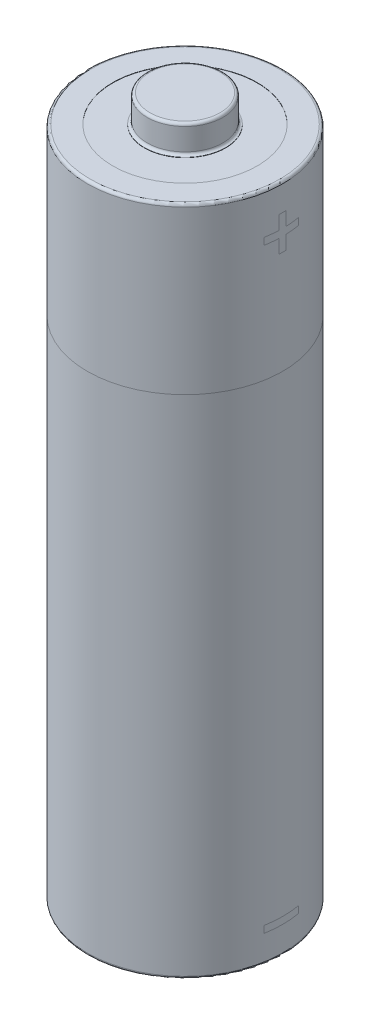
ISO-10303-21;
HEADER;
FILE_DESCRIPTION(('STEP AP214'),'2;1');
FILE_NAME('part.step','',(''),(''),'','','');
FILE_SCHEMA(('AUTOMOTIVE_DESIGN { 1 0 10303 214 1 1 1 1 }'));
ENDSEC;
DATA;
#1=APPLICATION_CONTEXT('core data for automotive mechanical design processes');
#2=APPLICATION_PROTOCOL_DEFINITION('international standard','automotive_design',2000,#1);
#3=PRODUCT_CONTEXT('',#1,'mechanical');
#4=PRODUCT('Part','Part','',(#3));
#5=PRODUCT_RELATED_PRODUCT_CATEGORY('part','',(#4));
#6=PRODUCT_DEFINITION_FORMATION('','',#4);
#7=PRODUCT_DEFINITION_CONTEXT('part definition',#1,'design');
#8=PRODUCT_DEFINITION('design','',#6,#7);
#9=PRODUCT_DEFINITION_SHAPE('','',#8);
#10=(LENGTH_UNIT() NAMED_UNIT(*) SI_UNIT(.MILLI.,.METRE.));
#11=(NAMED_UNIT(*) PLANE_ANGLE_UNIT() SI_UNIT($,.RADIAN.));
#12=(NAMED_UNIT(*) SI_UNIT($,.STERADIAN.) SOLID_ANGLE_UNIT());
#13=UNCERTAINTY_MEASURE_WITH_UNIT(LENGTH_MEASURE(1.E-05),#10,'distance_accuracy_value','');
#14=(GEOMETRIC_REPRESENTATION_CONTEXT(3) GLOBAL_UNCERTAINTY_ASSIGNED_CONTEXT((#13)) GLOBAL_UNIT_ASSIGNED_CONTEXT((#10,
#11,#12)) REPRESENTATION_CONTEXT('',''));
#15=CARTESIAN_POINT('',(0.,0.,0.));
#16=DIRECTION('',(0.,0.,1.));
#17=DIRECTION('',(1.,0.,0.));
#18=AXIS2_PLACEMENT_3D('',#15,#16,#17);
#19=CARTESIAN_POINT('',(0.,48.8,0.));
#20=DIRECTION('',(0.,-1.,0.));
#21=DIRECTION('',(0.,0.,-1.));
#22=AXIS2_PLACEMENT_3D('',#19,#20,#21);
#23=CYLINDRICAL_SURFACE('',#22,7.1);
#24=DIRECTION('',(0.,-1.,0.));
#25=VECTOR('',#24,1.);
#26=CARTESIAN_POINT('',(6.98909865433305,48.8,1.24999999999998));
#27=LINE('',#26,#25);
#28=CARTESIAN_POINT('',(6.98909865433305,2.5,1.25));
#29=VERTEX_POINT('',#28);
#30=CARTESIAN_POINT('',(6.98909865433305,2.,1.25));
#31=VERTEX_POINT('',#30);
#32=EDGE_CURVE('E25',#29,#31,#27,.T.);
#33=ORIENTED_EDGE('',*,*,#32,.F.);
#34=CARTESIAN_POINT('',(0.,2.5,0.));
#35=DIRECTION('',(0.,-1.,0.));
#36=DIRECTION('',(0.,0.,-1.));
#37=AXIS2_PLACEMENT_3D('',#34,#35,#36);
#38=CIRCLE('',#37,7.1);
#39=CARTESIAN_POINT('',(6.98909865433305,2.5,-1.25));
#40=VERTEX_POINT('',#39);
#41=EDGE_CURVE('E246',#40,#29,#38,.T.);
#42=ORIENTED_EDGE('',*,*,#41,.F.);
#43=DIRECTION('',(0.,-1.,0.));
#44=VECTOR('',#43,1.);
#45=CARTESIAN_POINT('',(6.98909865433305,48.8,-1.24999999999998));
#46=LINE('',#45,#44);
#47=CARTESIAN_POINT('',(6.98909865433305,2.,-1.24999999999998));
#48=VERTEX_POINT('',#47);
#49=EDGE_CURVE('E257',#48,#40,#46,.F.);
#50=ORIENTED_EDGE('',*,*,#49,.F.);
#51=CARTESIAN_POINT('',(0.,2.,0.));
#52=DIRECTION('',(0.,1.,0.));
#53=DIRECTION('',(0.,0.,1.));
#54=AXIS2_PLACEMENT_3D('',#51,#52,#53);
#55=CIRCLE('',#54,7.1);
#56=EDGE_CURVE('E41',#31,#48,#55,.T.);
#57=ORIENTED_EDGE('',*,*,#56,.F.);
#58=EDGE_LOOP('',(#33,#42,#50,#57));
#59=FACE_BOUND('',#58,.T.);
#60=CARTESIAN_POINT('',(0.,0.2,0.));
#61=DIRECTION('',(0.,1.,0.));
#62=DIRECTION('',(0.,0.,1.));
#63=AXIS2_PLACEMENT_3D('',#60,#61,#62);
#64=CIRCLE('',#63,7.1);
#65=CARTESIAN_POINT('',(0.,0.2,7.1));
#66=VERTEX_POINT('',#65);
#67=EDGE_CURVE('E265',#66,#66,#64,.T.);
#68=ORIENTED_EDGE('',*,*,#67,.T.);
#69=EDGE_LOOP('',(#68));
#70=FACE_BOUND('',#69,.T.);
#71=DIRECTION('',(0.,-1.,0.));
#72=VECTOR('',#71,1.);
#73=CARTESIAN_POINT('',(-6.98909865433305,48.8,1.24999999999998));
#74=LINE('',#73,#72);
#75=CARTESIAN_POINT('',(-6.98909865433305,2.,1.25));
#76=VERTEX_POINT('',#75);
#77=CARTESIAN_POINT('',(-6.98909865433305,2.5,1.25));
#78=VERTEX_POINT('',#77);
#79=EDGE_CURVE('E254',#76,#78,#74,.F.);
#80=ORIENTED_EDGE('',*,*,#79,.F.);
#81=CARTESIAN_POINT('',(-6.98909865433305,2.,-1.24999999999998));
#82=VERTEX_POINT('',#81);
#83=EDGE_CURVE('E250',#82,#76,#55,.T.);
#84=ORIENTED_EDGE('',*,*,#83,.F.);
#85=DIRECTION('',(0.,-1.,0.));
#86=VECTOR('',#85,1.);
#87=CARTESIAN_POINT('',(-6.98909865433305,48.8,-1.24999999999998));
#88=LINE('',#87,#86);
#89=CARTESIAN_POINT('',(-6.98909865433305,2.5,-1.25));
#90=VERTEX_POINT('',#89);
#91=EDGE_CURVE('E245',#90,#82,#88,.T.);
#92=ORIENTED_EDGE('',*,*,#91,.F.);
#93=EDGE_CURVE('E241',#78,#90,#38,.T.);
#94=ORIENTED_EDGE('',*,*,#93,.F.);
#95=EDGE_LOOP('',(#80,#84,#92,#94));
#96=FACE_BOUND('',#95,.T.);
#97=CARTESIAN_POINT('',(0.,36.8,0.));
#98=DIRECTION('',(0.,1.,0.));
#99=DIRECTION('',(0.,0.,1.));
#100=AXIS2_PLACEMENT_3D('',#97,#98,#99);
#101=CIRCLE('',#100,7.1);
#102=CARTESIAN_POINT('',(0.,36.8,7.1));
#103=VERTEX_POINT('',#102);
#104=EDGE_CURVE('E11',#103,#103,#101,.T.);
#105=ORIENTED_EDGE('',*,*,#104,.F.);
#106=EDGE_LOOP('',(#105));
#107=FACE_BOUND('',#106,.T.);
#108=ADVANCED_FACE('F16',(#59,#70,#96,#107),#23,.T.);
#109=ORIENTED_EDGE('',*,*,#104,.T.);
#110=EDGE_LOOP('',(#109));
#111=FACE_BOUND('',#110,.T.);
#112=CARTESIAN_POINT('',(0.,46.8,0.));
#113=DIRECTION('',(0.,-1.,0.));
#114=DIRECTION('',(0.,0.,-1.));
#115=AXIS2_PLACEMENT_3D('',#112,#113,#114);
#116=CIRCLE('',#115,7.1);
#117=CARTESIAN_POINT('',(7.09559722644965,46.8,-0.25));
#118=VERTEX_POINT('',#117);
#119=CARTESIAN_POINT('',(7.09559722644965,46.8,0.25));
#120=VERTEX_POINT('',#119);
#121=EDGE_CURVE('E173',#118,#120,#116,.T.);
#122=ORIENTED_EDGE('',*,*,#121,.F.);
#123=DIRECTION('',(0.,-1.,0.));
#124=VECTOR('',#123,1.);
#125=CARTESIAN_POINT('',(7.09559722644965,48.8,-0.25));
#126=LINE('',#125,#124);
#127=CARTESIAN_POINT('',(7.09559722644965,45.8,-0.25));
#128=VERTEX_POINT('',#127);
#129=EDGE_CURVE('E163',#128,#118,#126,.F.);
#130=ORIENTED_EDGE('',*,*,#129,.F.);
#131=CARTESIAN_POINT('',(0.,45.8,0.));
#132=DIRECTION('',(0.,-1.,0.));
#133=DIRECTION('',(0.,0.,-1.));
#134=AXIS2_PLACEMENT_3D('',#131,#132,#133);
#135=CIRCLE('',#134,7.1);
#136=CARTESIAN_POINT('',(6.98909865433305,45.8,-1.25));
#137=VERTEX_POINT('',#136);
#138=EDGE_CURVE('E160',#137,#128,#135,.T.);
#139=ORIENTED_EDGE('',*,*,#138,.F.);
#140=DIRECTION('',(0.,-1.,0.));
#141=VECTOR('',#140,1.);
#142=CARTESIAN_POINT('',(6.98909865433305,48.8,-1.25));
#143=LINE('',#142,#141);
#144=CARTESIAN_POINT('',(6.98909865433305,45.3,-1.25));
#145=VERTEX_POINT('',#144);
#146=EDGE_CURVE('E165',#145,#137,#143,.F.);
#147=ORIENTED_EDGE('',*,*,#146,.F.);
#148=CARTESIAN_POINT('',(0.,45.3,0.));
#149=DIRECTION('',(0.,1.,0.));
#150=DIRECTION('',(0.,0.,1.));
#151=AXIS2_PLACEMENT_3D('',#148,#149,#150);
#152=CIRCLE('',#151,7.1);
#153=CARTESIAN_POINT('',(7.09559722644965,45.3,-0.25));
#154=VERTEX_POINT('',#153);
#155=EDGE_CURVE('E188',#154,#145,#152,.T.);
#156=ORIENTED_EDGE('',*,*,#155,.F.);
#157=DIRECTION('',(0.,-1.,0.));
#158=VECTOR('',#157,1.);
#159=CARTESIAN_POINT('',(7.09559722644965,48.8,-0.250000000000004));
#160=LINE('',#159,#158);
#161=CARTESIAN_POINT('',(7.09559722644965,44.3,-0.250000000000004));
#162=VERTEX_POINT('',#161);
#163=EDGE_CURVE('E191',#162,#154,#160,.F.);
#164=ORIENTED_EDGE('',*,*,#163,.F.);
#165=CARTESIAN_POINT('',(0.,44.3,0.));
#166=DIRECTION('',(0.,1.,0.));
#167=DIRECTION('',(0.,0.,1.));
#168=AXIS2_PLACEMENT_3D('',#165,#166,#167);
#169=CIRCLE('',#168,7.1);
#170=CARTESIAN_POINT('',(7.09559722644965,44.3,0.25));
#171=VERTEX_POINT('',#170);
#172=EDGE_CURVE('E195',#171,#162,#169,.T.);
#173=ORIENTED_EDGE('',*,*,#172,.F.);
#174=DIRECTION('',(0.,-1.,0.));
#175=VECTOR('',#174,1.);
#176=CARTESIAN_POINT('',(7.09559722644965,48.8,0.250000000000004));
#177=LINE('',#176,#175);
#178=CARTESIAN_POINT('',(7.09559722644965,45.3,0.250000000000004));
#179=VERTEX_POINT('',#178);
#180=EDGE_CURVE('E198',#179,#171,#177,.T.);
#181=ORIENTED_EDGE('',*,*,#180,.F.);
#182=CARTESIAN_POINT('',(0.,45.3,0.));
#183=DIRECTION('',(0.,1.,0.));
#184=DIRECTION('',(0.,0.,1.));
#185=AXIS2_PLACEMENT_3D('',#182,#183,#184);
#186=CIRCLE('',#185,7.1);
#187=CARTESIAN_POINT('',(6.98909865433305,45.3,1.25));
#188=VERTEX_POINT('',#187);
#189=EDGE_CURVE('E201',#188,#179,#186,.T.);
#190=ORIENTED_EDGE('',*,*,#189,.F.);
#191=DIRECTION('',(0.,-1.,0.));
#192=VECTOR('',#191,1.);
#193=CARTESIAN_POINT('',(6.98909865433305,48.8,1.25));
#194=LINE('',#193,#192);
#195=CARTESIAN_POINT('',(6.98909865433305,45.8,1.25));
#196=VERTEX_POINT('',#195);
#197=EDGE_CURVE('E204',#196,#188,#194,.T.);
#198=ORIENTED_EDGE('',*,*,#197,.F.);
#199=CARTESIAN_POINT('',(0.,45.8,0.));
#200=DIRECTION('',(0.,-1.,0.));
#201=DIRECTION('',(0.,0.,-1.));
#202=AXIS2_PLACEMENT_3D('',#199,#200,#201);
#203=CIRCLE('',#202,7.1);
#204=CARTESIAN_POINT('',(7.09559722644965,45.8,0.25));
#205=VERTEX_POINT('',#204);
#206=EDGE_CURVE('E208',#205,#196,#203,.T.);
#207=ORIENTED_EDGE('',*,*,#206,.F.);
#208=DIRECTION('',(0.,-1.,0.));
#209=VECTOR('',#208,1.);
#210=CARTESIAN_POINT('',(7.09559722644965,48.8,0.25));
#211=LINE('',#210,#209);
#212=EDGE_CURVE('E211',#120,#205,#211,.T.);
#213=ORIENTED_EDGE('',*,*,#212,.F.);
#214=EDGE_LOOP('',(#122,#130,#139,#147,#156,#164,#173,#181,#190,#198,#207,#213));
#215=FACE_BOUND('',#214,.T.);
#216=CARTESIAN_POINT('',(0.,48.6,0.));
#217=DIRECTION('',(0.,1.,0.));
#218=DIRECTION('',(0.,0.,1.));
#219=AXIS2_PLACEMENT_3D('',#216,#217,#218);
#220=CIRCLE('',#219,7.1);
#221=CARTESIAN_POINT('',(0.,48.6,7.1));
#222=VERTEX_POINT('',#221);
#223=EDGE_CURVE('E321',#222,#222,#220,.F.);
#224=ORIENTED_EDGE('',*,*,#223,.T.);
#225=EDGE_LOOP('',(#224));
#226=FACE_BOUND('',#225,.T.);
#227=CARTESIAN_POINT('',(-7.09559722644965,46.8,0.25));
#228=VERTEX_POINT('',#227);
#229=CARTESIAN_POINT('',(-7.09559722644965,46.8,-0.25));
#230=VERTEX_POINT('',#229);
#231=EDGE_CURVE('E217',#228,#230,#116,.T.);
#232=ORIENTED_EDGE('',*,*,#231,.F.);
#233=DIRECTION('',(0.,-1.,0.));
#234=VECTOR('',#233,1.);
#235=CARTESIAN_POINT('',(-7.09559722644965,48.8,0.25));
#236=LINE('',#235,#234);
#237=CARTESIAN_POINT('',(-7.09559722644965,45.8,0.25));
#238=VERTEX_POINT('',#237);
#239=EDGE_CURVE('E237',#238,#228,#236,.F.);
#240=ORIENTED_EDGE('',*,*,#239,.F.);
#241=CARTESIAN_POINT('',(-6.98909865433305,45.8,1.25));
#242=VERTEX_POINT('',#241);
#243=EDGE_CURVE('E212',#242,#238,#203,.T.);
#244=ORIENTED_EDGE('',*,*,#243,.F.);
#245=DIRECTION('',(0.,-1.,0.));
#246=VECTOR('',#245,1.);
#247=CARTESIAN_POINT('',(-6.98909865433305,48.8,1.25));
#248=LINE('',#247,#246);
#249=CARTESIAN_POINT('',(-6.98909865433305,45.3,1.25));
#250=VERTEX_POINT('',#249);
#251=EDGE_CURVE('E233',#250,#242,#248,.F.);
#252=ORIENTED_EDGE('',*,*,#251,.F.);
#253=CARTESIAN_POINT('',(-7.09559722644965,45.3,0.250000000000004));
#254=VERTEX_POINT('',#253);
#255=EDGE_CURVE('E205',#254,#250,#186,.T.);
#256=ORIENTED_EDGE('',*,*,#255,.F.);
#257=DIRECTION('',(0.,-1.,0.));
#258=VECTOR('',#257,1.);
#259=CARTESIAN_POINT('',(-7.09559722644965,48.8,0.250000000000004));
#260=LINE('',#259,#258);
#261=CARTESIAN_POINT('',(-7.09559722644965,44.3,0.25));
#262=VERTEX_POINT('',#261);
#263=EDGE_CURVE('E229',#262,#254,#260,.F.);
#264=ORIENTED_EDGE('',*,*,#263,.F.);
#265=CARTESIAN_POINT('',(-7.09559722644965,44.3,-0.250000000000004));
#266=VERTEX_POINT('',#265);
#267=EDGE_CURVE('E199',#266,#262,#169,.T.);
#268=ORIENTED_EDGE('',*,*,#267,.F.);
#269=DIRECTION('',(0.,-1.,0.));
#270=VECTOR('',#269,1.);
#271=CARTESIAN_POINT('',(-7.09559722644965,48.8,-0.250000000000004));
#272=LINE('',#271,#270);
#273=CARTESIAN_POINT('',(-7.09559722644965,45.3,-0.25));
#274=VERTEX_POINT('',#273);
#275=EDGE_CURVE('E225',#274,#266,#272,.T.);
#276=ORIENTED_EDGE('',*,*,#275,.F.);
#277=CARTESIAN_POINT('',(-6.98909865433305,45.3,-1.25));
#278=VERTEX_POINT('',#277);
#279=EDGE_CURVE('E192',#278,#274,#152,.T.);
#280=ORIENTED_EDGE('',*,*,#279,.F.);
#281=DIRECTION('',(0.,-1.,0.));
#282=VECTOR('',#281,1.);
#283=CARTESIAN_POINT('',(-6.98909865433305,48.8,-1.25));
#284=LINE('',#283,#282);
#285=CARTESIAN_POINT('',(-6.98909865433305,45.8,-1.25));
#286=VERTEX_POINT('',#285);
#287=EDGE_CURVE('E221',#286,#278,#284,.T.);
#288=ORIENTED_EDGE('',*,*,#287,.F.);
#289=CARTESIAN_POINT('',(-7.09559722644965,45.8,-0.25));
#290=VERTEX_POINT('',#289);
#291=EDGE_CURVE('E169',#290,#286,#135,.T.);
#292=ORIENTED_EDGE('',*,*,#291,.F.);
#293=DIRECTION('',(0.,-1.,0.));
#294=VECTOR('',#293,1.);
#295=CARTESIAN_POINT('',(-7.09559722644965,48.8,-0.25));
#296=LINE('',#295,#294);
#297=EDGE_CURVE('E216',#230,#290,#296,.T.);
#298=ORIENTED_EDGE('',*,*,#297,.F.);
#299=EDGE_LOOP('',(#232,#240,#244,#252,#256,#264,#268,#276,#280,#288,#292,#298));
#300=FACE_BOUND('',#299,.T.);
#301=ADVANCED_FACE('F170',(#111,#215,#226,#300),#23,.T.);
#302=ORIENTED_EDGE('',*,*,#41,.T.);
#303=ORIENTED_EDGE('',*,*,#32,.T.);
#304=ORIENTED_EDGE('',*,*,#56,.T.);
#305=ORIENTED_EDGE('',*,*,#49,.T.);
#306=EDGE_LOOP('',(#302,#303,#304,#305));
#307=FACE_BOUND('',#306,.T.);
#308=ADVANCED_FACE('F268',(#307),#23,.T.);
#309=ORIENTED_EDGE('',*,*,#83,.T.);
#310=ORIENTED_EDGE('',*,*,#79,.T.);
#311=ORIENTED_EDGE('',*,*,#93,.T.);
#312=ORIENTED_EDGE('',*,*,#91,.T.);
#313=EDGE_LOOP('',(#309,#310,#311,#312));
#314=FACE_BOUND('',#313,.T.);
#315=ADVANCED_FACE('F285',(#314),#23,.T.);
#316=ORIENTED_EDGE('',*,*,#239,.T.);
#317=ORIENTED_EDGE('',*,*,#231,.T.);
#318=ORIENTED_EDGE('',*,*,#297,.T.);
#319=ORIENTED_EDGE('',*,*,#291,.T.);
#320=ORIENTED_EDGE('',*,*,#287,.T.);
#321=ORIENTED_EDGE('',*,*,#279,.T.);
#322=ORIENTED_EDGE('',*,*,#275,.T.);
#323=ORIENTED_EDGE('',*,*,#267,.T.);
#324=ORIENTED_EDGE('',*,*,#263,.T.);
#325=ORIENTED_EDGE('',*,*,#255,.T.);
#326=ORIENTED_EDGE('',*,*,#251,.T.);
#327=ORIENTED_EDGE('',*,*,#243,.T.);
#328=EDGE_LOOP('',(#316,#317,#318,#319,#320,#321,#322,#323,#324,#325,#326,#327));
#329=FACE_BOUND('',#328,.T.);
#330=ADVANCED_FACE('F291',(#329),#23,.T.);
#331=CARTESIAN_POINT('',(0.,50.8,0.));
#332=DIRECTION('',(0.,-1.,0.));
#333=DIRECTION('',(0.,0.,-1.));
#334=AXIS2_PLACEMENT_3D('',#331,#332,#333);
#335=CYLINDRICAL_SURFACE('',#334,2.75);
#336=CARTESIAN_POINT('',(0.,50.6,0.));
#337=DIRECTION('',(0.,1.,0.));
#338=DIRECTION('',(0.,0.,1.));
#339=AXIS2_PLACEMENT_3D('',#336,#337,#338);
#340=CIRCLE('',#339,2.75);
#341=CARTESIAN_POINT('',(0.,50.6,2.75));
#342=VERTEX_POINT('',#341);
#343=EDGE_CURVE('E341',#342,#342,#340,.F.);
#344=ORIENTED_EDGE('',*,*,#343,.T.);
#345=EDGE_LOOP('',(#344));
#346=FACE_BOUND('',#345,.T.);
#347=CARTESIAN_POINT('',(0.,49.,0.));
#348=DIRECTION('',(0.,1.,0.));
#349=DIRECTION('',(0.,0.,1.));
#350=AXIS2_PLACEMENT_3D('',#347,#348,#349);
#351=CIRCLE('',#350,2.75);
#352=CARTESIAN_POINT('',(0.,49.,2.75));
#353=VERTEX_POINT('',#352);
#354=EDGE_CURVE('E345',#353,#353,#351,.T.);
#355=ORIENTED_EDGE('',*,*,#354,.T.);
#356=EDGE_LOOP('',(#355));
#357=FACE_BOUND('',#356,.T.);
#358=ADVANCED_FACE('F406',(#346,#357),#335,.T.);
#359=CARTESIAN_POINT('',(0.,50.8,0.));
#360=DIRECTION('',(0.,1.,0.));
#361=DIRECTION('',(0.,0.,1.));
#362=AXIS2_PLACEMENT_3D('',#359,#360,#361);
#363=PLANE('',#362);
#364=CARTESIAN_POINT('',(0.,50.8,0.));
#365=DIRECTION('',(0.,1.,0.));
#366=DIRECTION('',(0.,0.,1.));
#367=AXIS2_PLACEMENT_3D('',#364,#365,#366);
#368=CIRCLE('',#367,2.55);
#369=CARTESIAN_POINT('',(0.,50.8,2.55));
#370=VERTEX_POINT('',#369);
#371=EDGE_CURVE('E349',#370,#370,#368,.T.);
#372=ORIENTED_EDGE('',*,*,#371,.T.);
#373=EDGE_LOOP('',(#372));
#374=FACE_BOUND('',#373,.T.);
#375=ADVANCED_FACE('F297',(#374),#363,.T.);
#376=CARTESIAN_POINT('',(0.,50.6,0.));
#377=DIRECTION('',(0.,1.,0.));
#378=DIRECTION('',(0.,0.,1.));
#379=AXIS2_PLACEMENT_3D('',#376,#377,#378);
#380=TOROIDAL_SURFACE('',#379,2.55,0.2);
#381=ORIENTED_EDGE('',*,*,#343,.F.);
#382=EDGE_LOOP('',(#381));
#383=FACE_BOUND('',#382,.T.);
#384=ORIENTED_EDGE('',*,*,#371,.F.);
#385=EDGE_LOOP('',(#384));
#386=FACE_BOUND('',#385,.T.);
#387=ADVANCED_FACE('F293',(#383,#386),#380,.T.);
#388=CARTESIAN_POINT('',(0.,49.,0.));
#389=DIRECTION('',(0.,1.,0.));
#390=DIRECTION('',(0.,0.,1.));
#391=AXIS2_PLACEMENT_3D('',#388,#389,#390);
#392=TOROIDAL_SURFACE('',#391,2.95,0.2);
#393=CARTESIAN_POINT('',(0.,48.8,0.));
#394=DIRECTION('',(0.,1.,0.));
#395=DIRECTION('',(0.,0.,1.));
#396=AXIS2_PLACEMENT_3D('',#393,#394,#395);
#397=CIRCLE('',#396,2.95);
#398=CARTESIAN_POINT('',(0.,48.8,2.95));
#399=VERTEX_POINT('',#398);
#400=EDGE_CURVE('E362',#399,#399,#397,.T.);
#401=ORIENTED_EDGE('',*,*,#400,.T.);
#402=EDGE_LOOP('',(#401));
#403=FACE_BOUND('',#402,.T.);
#404=ORIENTED_EDGE('',*,*,#354,.F.);
#405=EDGE_LOOP('',(#404));
#406=FACE_BOUND('',#405,.T.);
#407=ADVANCED_FACE('F296',(#403,#406),#392,.F.);
#408=CARTESIAN_POINT('',(0.,48.78,0.));
#409=DIRECTION('',(0.,1.,0.));
#410=DIRECTION('',(0.,0.,1.));
#411=AXIS2_PLACEMENT_3D('',#408,#409,#410);
#412=CYLINDRICAL_SURFACE('',#411,5.25);
#413=CARTESIAN_POINT('',(0.,48.78,0.));
#414=DIRECTION('',(0.,1.,0.));
#415=DIRECTION('',(0.,0.,1.));
#416=AXIS2_PLACEMENT_3D('',#413,#414,#415);
#417=CIRCLE('',#416,5.25);
#418=CARTESIAN_POINT('',(0.,48.78,5.25));
#419=VERTEX_POINT('',#418);
#420=EDGE_CURVE('E353',#419,#419,#417,.T.);
#421=ORIENTED_EDGE('',*,*,#420,.F.);
#422=EDGE_LOOP('',(#421));
#423=FACE_BOUND('',#422,.T.);
#424=CARTESIAN_POINT('',(0.,48.8,0.));
#425=DIRECTION('',(0.,1.,0.));
#426=DIRECTION('',(0.,0.,1.));
#427=AXIS2_PLACEMENT_3D('',#424,#425,#426);
#428=CIRCLE('',#427,5.25);
#429=CARTESIAN_POINT('',(0.,48.8,5.25));
#430=VERTEX_POINT('',#429);
#431=EDGE_CURVE('E354',#430,#430,#428,.T.);
#432=ORIENTED_EDGE('',*,*,#431,.T.);
#433=EDGE_LOOP('',(#432));
#434=FACE_BOUND('',#433,.T.);
#435=ADVANCED_FACE('F301',(#423,#434),#412,.F.);
#436=CARTESIAN_POINT('',(0.,48.78,0.));
#437=DIRECTION('',(0.,1.,0.));
#438=DIRECTION('',(0.,0.,1.));
#439=AXIS2_PLACEMENT_3D('',#436,#437,#438);
#440=PLANE('',#439);
#441=CARTESIAN_POINT('',(0.,48.78,0.));
#442=DIRECTION('',(0.,1.,0.));
#443=DIRECTION('',(0.,0.,1.));
#444=AXIS2_PLACEMENT_3D('',#441,#442,#443);
#445=CIRCLE('',#444,2.95);
#446=CARTESIAN_POINT('',(0.,48.78,2.95));
#447=VERTEX_POINT('',#446);
#448=EDGE_CURVE('E358',#447,#447,#445,.T.);
#449=ORIENTED_EDGE('',*,*,#448,.F.);
#450=EDGE_LOOP('',(#449));
#451=FACE_BOUND('',#450,.T.);
#452=ORIENTED_EDGE('',*,*,#420,.T.);
#453=EDGE_LOOP('',(#452));
#454=FACE_BOUND('',#453,.T.);
#455=ADVANCED_FACE('F390',(#451,#454),#440,.T.);
#456=CARTESIAN_POINT('',(0.,48.78,0.));
#457=DIRECTION('',(0.,1.,0.));
#458=DIRECTION('',(0.,0.,1.));
#459=AXIS2_PLACEMENT_3D('',#456,#457,#458);
#460=CYLINDRICAL_SURFACE('',#459,2.95);
#461=ORIENTED_EDGE('',*,*,#448,.T.);
#462=EDGE_LOOP('',(#461));
#463=FACE_BOUND('',#462,.T.);
#464=ORIENTED_EDGE('',*,*,#400,.F.);
#465=EDGE_LOOP('',(#464));
#466=FACE_BOUND('',#465,.T.);
#467=ADVANCED_FACE('F385',(#463,#466),#460,.T.);
#468=CARTESIAN_POINT('',(0.,0.,0.));
#469=DIRECTION('',(0.,1.,0.));
#470=DIRECTION('',(0.,0.,1.));
#471=AXIS2_PLACEMENT_3D('',#468,#469,#470);
#472=PLANE('',#471);
#473=CARTESIAN_POINT('',(0.,0.,0.));
#474=DIRECTION('',(0.,1.,0.));
#475=DIRECTION('',(0.,0.,1.));
#476=AXIS2_PLACEMENT_3D('',#473,#474,#475);
#477=CIRCLE('',#476,6.9);
#478=CARTESIAN_POINT('',(0.,0.,6.9));
#479=VERTEX_POINT('',#478);
#480=EDGE_CURVE('E182',#479,#479,#477,.F.);
#481=ORIENTED_EDGE('',*,*,#480,.T.);
#482=EDGE_LOOP('',(#481));
#483=FACE_BOUND('',#482,.T.);
#484=CARTESIAN_POINT('',(0.,0.,0.));
#485=DIRECTION('',(0.,-1.,0.));
#486=DIRECTION('',(0.,0.,-1.));
#487=AXIS2_PLACEMENT_3D('',#484,#485,#486);
#488=CIRCLE('',#487,6.);
#489=CARTESIAN_POINT('',(0.,0.,-6.));
#490=VERTEX_POINT('',#489);
#491=EDGE_CURVE('E333',#490,#490,#488,.T.);
#492=ORIENTED_EDGE('',*,*,#491,.F.);
#493=EDGE_LOOP('',(#492));
#494=FACE_BOUND('',#493,.T.);
#495=ADVANCED_FACE('F290',(#483,#494),#472,.F.);
#496=ORIENTED_EDGE('',*,*,#129,.T.);
#497=ORIENTED_EDGE('',*,*,#121,.T.);
#498=ORIENTED_EDGE('',*,*,#212,.T.);
#499=ORIENTED_EDGE('',*,*,#206,.T.);
#500=ORIENTED_EDGE('',*,*,#197,.T.);
#501=ORIENTED_EDGE('',*,*,#189,.T.);
#502=ORIENTED_EDGE('',*,*,#180,.T.);
#503=ORIENTED_EDGE('',*,*,#172,.T.);
#504=ORIENTED_EDGE('',*,*,#163,.T.);
#505=ORIENTED_EDGE('',*,*,#155,.T.);
#506=ORIENTED_EDGE('',*,*,#146,.T.);
#507=ORIENTED_EDGE('',*,*,#138,.T.);
#508=EDGE_LOOP('',(#496,#497,#498,#499,#500,#501,#502,#503,#504,#505,#506,#507));
#509=FACE_BOUND('',#508,.T.);
#510=ADVANCED_FACE('F162',(#509),#23,.T.);
#511=CARTESIAN_POINT('',(0.,48.8,0.));
#512=DIRECTION('',(0.,1.,0.));
#513=DIRECTION('',(0.,0.,1.));
#514=AXIS2_PLACEMENT_3D('',#511,#512,#513);
#515=PLANE('',#514);
#516=CARTESIAN_POINT('',(0.,48.8,0.));
#517=DIRECTION('',(0.,1.,0.));
#518=DIRECTION('',(0.,0.,1.));
#519=AXIS2_PLACEMENT_3D('',#516,#517,#518);
#520=CIRCLE('',#519,6.9);
#521=CARTESIAN_POINT('',(0.,48.8,6.9));
#522=VERTEX_POINT('',#521);
#523=EDGE_CURVE('E175',#522,#522,#520,.T.);
#524=ORIENTED_EDGE('',*,*,#523,.T.);
#525=EDGE_LOOP('',(#524));
#526=FACE_BOUND('',#525,.T.);
#527=ORIENTED_EDGE('',*,*,#431,.F.);
#528=EDGE_LOOP('',(#527));
#529=FACE_BOUND('',#528,.T.);
#530=ADVANCED_FACE('F289',(#526,#529),#515,.T.);
#531=CARTESIAN_POINT('',(0.,0.02,0.));
#532=DIRECTION('',(0.,-1.,0.));
#533=DIRECTION('',(0.,0.,-1.));
#534=AXIS2_PLACEMENT_3D('',#531,#532,#533);
#535=CYLINDRICAL_SURFACE('',#534,6.);
#536=CARTESIAN_POINT('',(0.,0.02,0.));
#537=DIRECTION('',(0.,-1.,0.));
#538=DIRECTION('',(0.,0.,-1.));
#539=AXIS2_PLACEMENT_3D('',#536,#537,#538);
#540=CIRCLE('',#539,6.);
#541=CARTESIAN_POINT('',(0.,0.02,-6.));
#542=VERTEX_POINT('',#541);
#543=EDGE_CURVE('E366',#542,#542,#540,.T.);
#544=ORIENTED_EDGE('',*,*,#543,.F.);
#545=EDGE_LOOP('',(#544));
#546=FACE_BOUND('',#545,.T.);
#547=ORIENTED_EDGE('',*,*,#491,.T.);
#548=EDGE_LOOP('',(#547));
#549=FACE_BOUND('',#548,.T.);
#550=ADVANCED_FACE('F378',(#546,#549),#535,.F.);
#551=CARTESIAN_POINT('',(0.,0.02,0.));
#552=DIRECTION('',(0.,-1.,0.));
#553=DIRECTION('',(0.,0.,-1.));
#554=AXIS2_PLACEMENT_3D('',#551,#552,#553);
#555=PLANE('',#554);
#556=CARTESIAN_POINT('',(0.,0.02,0.));
#557=DIRECTION('',(0.,-1.,0.));
#558=DIRECTION('',(0.,0.,-1.));
#559=AXIS2_PLACEMENT_3D('',#556,#557,#558);
#560=CIRCLE('',#559,5.3);
#561=CARTESIAN_POINT('',(0.,0.02,-5.3));
#562=VERTEX_POINT('',#561);
#563=EDGE_CURVE('E337',#562,#562,#560,.F.);
#564=ORIENTED_EDGE('',*,*,#563,.T.);
#565=EDGE_LOOP('',(#564));
#566=FACE_BOUND('',#565,.T.);
#567=ORIENTED_EDGE('',*,*,#543,.T.);
#568=EDGE_LOOP('',(#567));
#569=FACE_BOUND('',#568,.T.);
#570=ADVANCED_FACE('F376',(#566,#569),#555,.T.);
#571=CARTESIAN_POINT('',(0.,-0.08,0.));
#572=DIRECTION('',(0.,-1.,0.));
#573=DIRECTION('',(0.,0.,-1.));
#574=AXIS2_PLACEMENT_3D('',#571,#572,#573);
#575=PLANE('',#574);
#576=CARTESIAN_POINT('',(0.,-0.08,0.));
#577=DIRECTION('',(0.,-1.,0.));
#578=DIRECTION('',(0.,0.,-1.));
#579=AXIS2_PLACEMENT_3D('',#576,#577,#578);
#580=CIRCLE('',#579,5.2);
#581=CARTESIAN_POINT('',(0.,-0.08,-5.2));
#582=VERTEX_POINT('',#581);
#583=EDGE_CURVE('E326',#582,#582,#580,.T.);
#584=ORIENTED_EDGE('',*,*,#583,.T.);
#585=EDGE_LOOP('',(#584));
#586=FACE_BOUND('',#585,.T.);
#587=ADVANCED_FACE('F310',(#586),#575,.T.);
#588=CARTESIAN_POINT('',(0.,-0.03,0.));
#589=DIRECTION('',(0.,-1.,0.));
#590=DIRECTION('',(0.,0.,-1.));
#591=AXIS2_PLACEMENT_3D('',#588,#589,#590);
#592=TOROIDAL_SURFACE('',#591,5.2,0.05);
#593=ORIENTED_EDGE('',*,*,#583,.F.);
#594=EDGE_LOOP('',(#593));
#595=FACE_BOUND('',#594,.T.);
#596=CARTESIAN_POINT('',(0.,-0.03,0.));
#597=DIRECTION('',(0.,-1.,0.));
#598=DIRECTION('',(0.,0.,-1.));
#599=AXIS2_PLACEMENT_3D('',#596,#597,#598);
#600=CIRCLE('',#599,5.25);
#601=CARTESIAN_POINT('',(0.,-0.03,-5.25));
#602=VERTEX_POINT('',#601);
#603=EDGE_CURVE('E329',#602,#602,#600,.F.);
#604=ORIENTED_EDGE('',*,*,#603,.F.);
#605=EDGE_LOOP('',(#604));
#606=FACE_BOUND('',#605,.T.);
#607=ADVANCED_FACE('F307',(#595,#606),#592,.T.);
#608=CARTESIAN_POINT('',(0.,-0.03,0.));
#609=DIRECTION('',(0.,-1.,0.));
#610=DIRECTION('',(0.,0.,-1.));
#611=AXIS2_PLACEMENT_3D('',#608,#609,#610);
#612=TOROIDAL_SURFACE('',#611,5.3,0.05);
#613=ORIENTED_EDGE('',*,*,#563,.F.);
#614=EDGE_LOOP('',(#613));
#615=FACE_BOUND('',#614,.T.);
#616=ORIENTED_EDGE('',*,*,#603,.T.);
#617=EDGE_LOOP('',(#616));
#618=FACE_BOUND('',#617,.T.);
#619=ADVANCED_FACE('F303',(#615,#618),#612,.F.);
#620=CARTESIAN_POINT('',(0.,0.2,0.));
#621=DIRECTION('',(0.,1.,0.));
#622=DIRECTION('',(0.,0.,1.));
#623=AXIS2_PLACEMENT_3D('',#620,#621,#622);
#624=TOROIDAL_SURFACE('',#623,6.9,0.2);
#625=ORIENTED_EDGE('',*,*,#480,.F.);
#626=EDGE_LOOP('',(#625));
#627=FACE_BOUND('',#626,.T.);
#628=ORIENTED_EDGE('',*,*,#67,.F.);
#629=EDGE_LOOP('',(#628));
#630=FACE_BOUND('',#629,.T.);
#631=ADVANCED_FACE('F306',(#627,#630),#624,.T.);
#632=CARTESIAN_POINT('',(0.,48.6,0.));
#633=DIRECTION('',(0.,1.,0.));
#634=DIRECTION('',(0.,0.,1.));
#635=AXIS2_PLACEMENT_3D('',#632,#633,#634);
#636=TOROIDAL_SURFACE('',#635,6.9,0.2);
#637=ORIENTED_EDGE('',*,*,#223,.F.);
#638=EDGE_LOOP('',(#637));
#639=FACE_BOUND('',#638,.T.);
#640=ORIENTED_EDGE('',*,*,#523,.F.);
#641=EDGE_LOOP('',(#640));
#642=FACE_BOUND('',#641,.T.);
#643=ADVANCED_FACE('F18',(#639,#642),#636,.T.);
#644=CLOSED_SHELL('',(#108,#301,#308,#315,#330,#358,#375,#387,#407,#435,#455,#467,#495,#510,
#530,#550,#570,#587,#607,#619,#631,#643));
#645=MANIFOLD_SOLID_BREP('B1',#644);
#646=ADVANCED_BREP_SHAPE_REPRESENTATION('',(#18,#645),#14);
#647=SHAPE_DEFINITION_REPRESENTATION(#9,#646);
ENDSEC;
END-ISO-10303-21;
